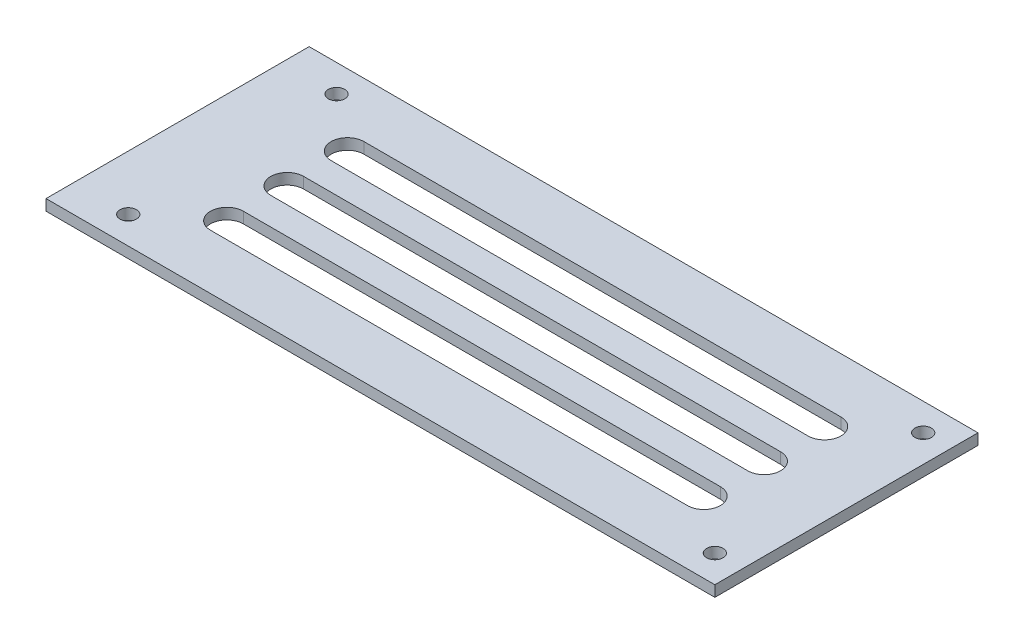
ISO-10303-21;
HEADER;
FILE_DESCRIPTION(('STEP AP214'),'2;1');
FILE_NAME('part.step','',(''),(''),'','','');
FILE_SCHEMA(('AUTOMOTIVE_DESIGN { 1 0 10303 214 1 1 1 1 }'));
ENDSEC;
DATA;
#1=APPLICATION_CONTEXT('core data for automotive mechanical design processes');
#2=APPLICATION_PROTOCOL_DEFINITION('international standard','automotive_design',2000,#1);
#3=PRODUCT_CONTEXT('',#1,'mechanical');
#4=PRODUCT('Part','Part','',(#3));
#5=PRODUCT_RELATED_PRODUCT_CATEGORY('part','',(#4));
#6=PRODUCT_DEFINITION_FORMATION('','',#4);
#7=PRODUCT_DEFINITION_CONTEXT('part definition',#1,'design');
#8=PRODUCT_DEFINITION('design','',#6,#7);
#9=PRODUCT_DEFINITION_SHAPE('','',#8);
#10=(LENGTH_UNIT() NAMED_UNIT(*) SI_UNIT(.MILLI.,.METRE.));
#11=(NAMED_UNIT(*) PLANE_ANGLE_UNIT() SI_UNIT($,.RADIAN.));
#12=(NAMED_UNIT(*) SI_UNIT($,.STERADIAN.) SOLID_ANGLE_UNIT());
#13=UNCERTAINTY_MEASURE_WITH_UNIT(LENGTH_MEASURE(1.E-05),#10,'distance_accuracy_value','');
#14=(GEOMETRIC_REPRESENTATION_CONTEXT(3) GLOBAL_UNCERTAINTY_ASSIGNED_CONTEXT((#13)) GLOBAL_UNIT_ASSIGNED_CONTEXT((#10,
#11,#12)) REPRESENTATION_CONTEXT('',''));
#15=CARTESIAN_POINT('',(0.,0.,0.));
#16=DIRECTION('',(0.,0.,1.));
#17=DIRECTION('',(1.,0.,0.));
#18=AXIS2_PLACEMENT_3D('',#15,#16,#17);
#19=CARTESIAN_POINT('',(0.,2.,0.));
#20=DIRECTION('',(0.,-1.,0.));
#21=DIRECTION('',(0.,0.,-1.));
#22=AXIS2_PLACEMENT_3D('',#19,#20,#21);
#23=PLANE('',#22);
#24=DIRECTION('',(1.,0.,0.));
#25=VECTOR('',#24,1.);
#26=CARTESIAN_POINT('',(9.99999999999969,2.,-27.));
#27=LINE('',#26,#25);
#28=CARTESIAN_POINT('',(9.99999999999969,2.,-27.));
#29=VERTEX_POINT('',#28);
#30=CARTESIAN_POINT('',(97.0000000000001,2.,-27.));
#31=VERTEX_POINT('',#30);
#32=EDGE_CURVE('E179',#29,#31,#27,.T.);
#33=ORIENTED_EDGE('',*,*,#32,.F.);
#34=CARTESIAN_POINT('',(10.0000000000001,2.,-30.));
#35=DIRECTION('',(0.,1.,0.));
#36=DIRECTION('',(0.,0.,1.));
#37=AXIS2_PLACEMENT_3D('',#34,#35,#36);
#38=CIRCLE('',#37,2.99999999999999);
#39=CARTESIAN_POINT('',(9.99999999999969,2.,-33.));
#40=VERTEX_POINT('',#39);
#41=EDGE_CURVE('E51',#40,#29,#38,.T.);
#42=ORIENTED_EDGE('',*,*,#41,.F.);
#43=DIRECTION('',(-1.,0.,0.));
#44=VECTOR('',#43,1.);
#45=CARTESIAN_POINT('',(9.99999999999969,2.,-33.));
#46=LINE('',#45,#44);
#47=CARTESIAN_POINT('',(97.0000000000001,2.,-33.));
#48=VERTEX_POINT('',#47);
#49=EDGE_CURVE('E170',#48,#40,#46,.T.);
#50=ORIENTED_EDGE('',*,*,#49,.F.);
#51=CARTESIAN_POINT('',(97.0000000000001,2.,-30.));
#52=DIRECTION('',(0.,1.,0.));
#53=DIRECTION('',(0.,0.,1.));
#54=AXIS2_PLACEMENT_3D('',#51,#52,#53);
#55=CIRCLE('',#54,3.);
#56=EDGE_CURVE('E173',#31,#48,#55,.T.);
#57=ORIENTED_EDGE('',*,*,#56,.F.);
#58=EDGE_LOOP('',(#33,#42,#50,#57));
#59=FACE_BOUND('',#58,.T.);
#60=DIRECTION('',(1.,0.,0.));
#61=VECTOR('',#60,1.);
#62=CARTESIAN_POINT('',(9.9999999999998,2.,-16.));
#63=LINE('',#62,#61);
#64=CARTESIAN_POINT('',(9.9999999999998,2.,-16.));
#65=VERTEX_POINT('',#64);
#66=CARTESIAN_POINT('',(97.0000000000002,2.,-16.));
#67=VERTEX_POINT('',#66);
#68=EDGE_CURVE('E205',#65,#67,#63,.T.);
#69=ORIENTED_EDGE('',*,*,#68,.F.);
#70=CARTESIAN_POINT('',(9.9999999999998,2.,-19.));
#71=DIRECTION('',(0.,1.,0.));
#72=DIRECTION('',(0.,0.,1.));
#73=AXIS2_PLACEMENT_3D('',#70,#71,#72);
#74=CIRCLE('',#73,2.99999999999999);
#75=CARTESIAN_POINT('',(9.9999999999998,2.,-22.));
#76=VERTEX_POINT('',#75);
#77=EDGE_CURVE('E59',#76,#65,#74,.T.);
#78=ORIENTED_EDGE('',*,*,#77,.F.);
#79=DIRECTION('',(-1.,0.,0.));
#80=VECTOR('',#79,1.);
#81=CARTESIAN_POINT('',(9.9999999999998,2.,-22.));
#82=LINE('',#81,#80);
#83=CARTESIAN_POINT('',(97.0000000000002,2.,-22.));
#84=VERTEX_POINT('',#83);
#85=EDGE_CURVE('E194',#84,#76,#82,.T.);
#86=ORIENTED_EDGE('',*,*,#85,.F.);
#87=CARTESIAN_POINT('',(97.0000000000002,2.,-19.));
#88=DIRECTION('',(0.,1.,0.));
#89=DIRECTION('',(0.,0.,1.));
#90=AXIS2_PLACEMENT_3D('',#87,#88,#89);
#91=CIRCLE('',#90,3.);
#92=EDGE_CURVE('E209',#67,#84,#91,.T.);
#93=ORIENTED_EDGE('',*,*,#92,.F.);
#94=EDGE_LOOP('',(#69,#78,#86,#93));
#95=FACE_BOUND('',#94,.T.);
#96=DIRECTION('',(1.,0.,0.));
#97=VECTOR('',#96,1.);
#98=CARTESIAN_POINT('',(9.99999999999992,2.,-5.));
#99=LINE('',#98,#97);
#100=CARTESIAN_POINT('',(9.99999999999992,2.,-5.));
#101=VERTEX_POINT('',#100);
#102=CARTESIAN_POINT('',(97.0000000000003,2.,-4.99999999999999));
#103=VERTEX_POINT('',#102);
#104=EDGE_CURVE('E236',#101,#103,#99,.T.);
#105=ORIENTED_EDGE('',*,*,#104,.F.);
#106=CARTESIAN_POINT('',(9.99999999999992,2.,-7.99999999999999));
#107=DIRECTION('',(0.,1.,0.));
#108=DIRECTION('',(0.,0.,1.));
#109=AXIS2_PLACEMENT_3D('',#106,#107,#108);
#110=CIRCLE('',#109,2.99999999999999);
#111=CARTESIAN_POINT('',(9.99999999999992,2.,-11.));
#112=VERTEX_POINT('',#111);
#113=EDGE_CURVE('E234',#112,#101,#110,.T.);
#114=ORIENTED_EDGE('',*,*,#113,.F.);
#115=DIRECTION('',(-1.,0.,0.));
#116=VECTOR('',#115,1.);
#117=CARTESIAN_POINT('',(9.99999999999992,2.,-11.));
#118=LINE('',#117,#116);
#119=CARTESIAN_POINT('',(97.0000000000003,2.,-11.));
#120=VERTEX_POINT('',#119);
#121=EDGE_CURVE('E224',#120,#112,#118,.T.);
#122=ORIENTED_EDGE('',*,*,#121,.F.);
#123=CARTESIAN_POINT('',(97.0000000000003,2.,-7.99999999999999));
#124=DIRECTION('',(0.,1.,0.));
#125=DIRECTION('',(0.,0.,1.));
#126=AXIS2_PLACEMENT_3D('',#123,#124,#125);
#127=CIRCLE('',#126,3.);
#128=EDGE_CURVE('E239',#103,#120,#127,.T.);
#129=ORIENTED_EDGE('',*,*,#128,.F.);
#130=EDGE_LOOP('',(#105,#114,#122,#129));
#131=FACE_BOUND('',#130,.T.);
#132=DIRECTION('',(0.,0.,1.));
#133=VECTOR('',#132,1.);
#134=CARTESIAN_POINT('',(-10.,2.,5.));
#135=LINE('',#134,#133);
#136=CARTESIAN_POINT('',(-10.,2.,-43.));
#137=VERTEX_POINT('',#136);
#138=CARTESIAN_POINT('',(-10.,2.,5.));
#139=VERTEX_POINT('',#138);
#140=EDGE_CURVE('E275',#137,#139,#135,.T.);
#141=ORIENTED_EDGE('',*,*,#140,.T.);
#142=DIRECTION('',(1.,0.,0.));
#143=VECTOR('',#142,1.);
#144=CARTESIAN_POINT('',(-10.,2.,5.));
#145=LINE('',#144,#143);
#146=CARTESIAN_POINT('',(112.,2.,5.));
#147=VERTEX_POINT('',#146);
#148=EDGE_CURVE('E278',#139,#147,#145,.T.);
#149=ORIENTED_EDGE('',*,*,#148,.T.);
#150=DIRECTION('',(0.,0.,-1.));
#151=VECTOR('',#150,1.);
#152=CARTESIAN_POINT('',(112.,2.,5.));
#153=LINE('',#152,#151);
#154=CARTESIAN_POINT('',(112.,2.,-43.));
#155=VERTEX_POINT('',#154);
#156=EDGE_CURVE('E281',#147,#155,#153,.T.);
#157=ORIENTED_EDGE('',*,*,#156,.T.);
#158=DIRECTION('',(-1.,0.,0.));
#159=VECTOR('',#158,1.);
#160=CARTESIAN_POINT('',(-10.,2.,-43.));
#161=LINE('',#160,#159);
#162=EDGE_CURVE('E283',#155,#137,#161,.T.);
#163=ORIENTED_EDGE('',*,*,#162,.T.);
#164=EDGE_LOOP('',(#141,#149,#157,#163));
#165=FACE_BOUND('',#164,.T.);
#166=CARTESIAN_POINT('',(0.,2.,-38.));
#167=DIRECTION('',(0.,1.,0.));
#168=DIRECTION('',(0.,0.,1.));
#169=AXIS2_PLACEMENT_3D('',#166,#167,#168);
#170=CIRCLE('',#169,1.5);
#171=CARTESIAN_POINT('',(0.,2.,-36.5));
#172=VERTEX_POINT('',#171);
#173=EDGE_CURVE('E269',#172,#172,#170,.T.);
#174=ORIENTED_EDGE('',*,*,#173,.F.);
#175=EDGE_LOOP('',(#174));
#176=FACE_BOUND('',#175,.T.);
#177=CARTESIAN_POINT('',(0.,2.,0.));
#178=DIRECTION('',(0.,1.,0.));
#179=DIRECTION('',(0.,0.,1.));
#180=AXIS2_PLACEMENT_3D('',#177,#178,#179);
#181=CIRCLE('',#180,1.5);
#182=CARTESIAN_POINT('',(0.,2.,1.5));
#183=VERTEX_POINT('',#182);
#184=EDGE_CURVE('E263',#183,#183,#181,.T.);
#185=ORIENTED_EDGE('',*,*,#184,.F.);
#186=EDGE_LOOP('',(#185));
#187=FACE_BOUND('',#186,.T.);
#188=CARTESIAN_POINT('',(107.,2.,-38.));
#189=DIRECTION('',(0.,1.,0.));
#190=DIRECTION('',(0.,0.,1.));
#191=AXIS2_PLACEMENT_3D('',#188,#189,#190);
#192=CIRCLE('',#191,1.5);
#193=CARTESIAN_POINT('',(107.,2.,-36.5));
#194=VERTEX_POINT('',#193);
#195=EDGE_CURVE('E257',#194,#194,#192,.T.);
#196=ORIENTED_EDGE('',*,*,#195,.F.);
#197=EDGE_LOOP('',(#196));
#198=FACE_BOUND('',#197,.T.);
#199=CARTESIAN_POINT('',(107.,2.,0.));
#200=DIRECTION('',(0.,1.,0.));
#201=DIRECTION('',(0.,0.,1.));
#202=AXIS2_PLACEMENT_3D('',#199,#200,#201);
#203=CIRCLE('',#202,1.5);
#204=CARTESIAN_POINT('',(107.,2.,1.5));
#205=VERTEX_POINT('',#204);
#206=EDGE_CURVE('E251',#205,#205,#203,.T.);
#207=ORIENTED_EDGE('',*,*,#206,.F.);
#208=EDGE_LOOP('',(#207));
#209=FACE_BOUND('',#208,.T.);
#210=ADVANCED_FACE('F36',(#59,#95,#131,#165,#176,#187,#198,#209),#23,.F.);
#211=CARTESIAN_POINT('',(0.,0.,0.));
#212=DIRECTION('',(0.,-1.,0.));
#213=DIRECTION('',(0.,0.,-1.));
#214=AXIS2_PLACEMENT_3D('',#211,#212,#213);
#215=PLANE('',#214);
#216=CARTESIAN_POINT('',(10.0000000000001,0.,-30.));
#217=DIRECTION('',(0.,1.,0.));
#218=DIRECTION('',(0.,0.,1.));
#219=AXIS2_PLACEMENT_3D('',#216,#217,#218);
#220=CIRCLE('',#219,2.99999999999999);
#221=CARTESIAN_POINT('',(9.99999999999969,0.,-33.));
#222=VERTEX_POINT('',#221);
#223=CARTESIAN_POINT('',(9.99999999999969,0.,-27.));
#224=VERTEX_POINT('',#223);
#225=EDGE_CURVE('E151',#222,#224,#220,.T.);
#226=ORIENTED_EDGE('',*,*,#225,.T.);
#227=DIRECTION('',(1.,0.,0.));
#228=VECTOR('',#227,1.);
#229=CARTESIAN_POINT('',(9.99999999999969,0.,-27.));
#230=LINE('',#229,#228);
#231=CARTESIAN_POINT('',(97.0000000000001,0.,-27.));
#232=VERTEX_POINT('',#231);
#233=EDGE_CURVE('E161',#224,#232,#230,.T.);
#234=ORIENTED_EDGE('',*,*,#233,.T.);
#235=CARTESIAN_POINT('',(97.0000000000001,0.,-30.));
#236=DIRECTION('',(0.,1.,0.));
#237=DIRECTION('',(0.,0.,1.));
#238=AXIS2_PLACEMENT_3D('',#235,#236,#237);
#239=CIRCLE('',#238,3.);
#240=CARTESIAN_POINT('',(97.0000000000001,0.,-33.));
#241=VERTEX_POINT('',#240);
#242=EDGE_CURVE('E165',#232,#241,#239,.T.);
#243=ORIENTED_EDGE('',*,*,#242,.T.);
#244=DIRECTION('',(-1.,0.,0.));
#245=VECTOR('',#244,1.);
#246=CARTESIAN_POINT('',(9.99999999999969,0.,-33.));
#247=LINE('',#246,#245);
#248=EDGE_CURVE('E157',#241,#222,#247,.T.);
#249=ORIENTED_EDGE('',*,*,#248,.T.);
#250=EDGE_LOOP('',(#226,#234,#243,#249));
#251=FACE_BOUND('',#250,.T.);
#252=CARTESIAN_POINT('',(9.9999999999998,0.,-19.));
#253=DIRECTION('',(0.,1.,0.));
#254=DIRECTION('',(0.,0.,1.));
#255=AXIS2_PLACEMENT_3D('',#252,#253,#254);
#256=CIRCLE('',#255,2.99999999999999);
#257=CARTESIAN_POINT('',(9.9999999999998,0.,-22.));
#258=VERTEX_POINT('',#257);
#259=CARTESIAN_POINT('',(9.9999999999998,0.,-16.));
#260=VERTEX_POINT('',#259);
#261=EDGE_CURVE('E190',#258,#260,#256,.T.);
#262=ORIENTED_EDGE('',*,*,#261,.T.);
#263=DIRECTION('',(1.,0.,0.));
#264=VECTOR('',#263,1.);
#265=CARTESIAN_POINT('',(9.9999999999998,0.,-16.));
#266=LINE('',#265,#264);
#267=CARTESIAN_POINT('',(97.0000000000002,0.,-16.));
#268=VERTEX_POINT('',#267);
#269=EDGE_CURVE('E193',#260,#268,#266,.T.);
#270=ORIENTED_EDGE('',*,*,#269,.T.);
#271=CARTESIAN_POINT('',(97.0000000000002,0.,-19.));
#272=DIRECTION('',(0.,1.,0.));
#273=DIRECTION('',(0.,0.,1.));
#274=AXIS2_PLACEMENT_3D('',#271,#272,#273);
#275=CIRCLE('',#274,3.);
#276=CARTESIAN_POINT('',(97.0000000000002,0.,-22.));
#277=VERTEX_POINT('',#276);
#278=EDGE_CURVE('E197',#268,#277,#275,.T.);
#279=ORIENTED_EDGE('',*,*,#278,.T.);
#280=DIRECTION('',(-1.,0.,0.));
#281=VECTOR('',#280,1.);
#282=CARTESIAN_POINT('',(9.9999999999998,0.,-22.));
#283=LINE('',#282,#281);
#284=EDGE_CURVE('E200',#277,#258,#283,.T.);
#285=ORIENTED_EDGE('',*,*,#284,.T.);
#286=EDGE_LOOP('',(#262,#270,#279,#285));
#287=FACE_BOUND('',#286,.T.);
#288=CARTESIAN_POINT('',(9.99999999999992,0.,-7.99999999999999));
#289=DIRECTION('',(0.,1.,0.));
#290=DIRECTION('',(0.,0.,1.));
#291=AXIS2_PLACEMENT_3D('',#288,#289,#290);
#292=CIRCLE('',#291,2.99999999999999);
#293=CARTESIAN_POINT('',(9.99999999999992,0.,-11.));
#294=VERTEX_POINT('',#293);
#295=CARTESIAN_POINT('',(9.99999999999992,0.,-5.));
#296=VERTEX_POINT('',#295);
#297=EDGE_CURVE('E220',#294,#296,#292,.T.);
#298=ORIENTED_EDGE('',*,*,#297,.T.);
#299=DIRECTION('',(1.,0.,0.));
#300=VECTOR('',#299,1.);
#301=CARTESIAN_POINT('',(9.99999999999992,0.,-5.));
#302=LINE('',#301,#300);
#303=CARTESIAN_POINT('',(97.0000000000003,0.,-4.99999999999999));
#304=VERTEX_POINT('',#303);
#305=EDGE_CURVE('E223',#296,#304,#302,.T.);
#306=ORIENTED_EDGE('',*,*,#305,.T.);
#307=CARTESIAN_POINT('',(97.0000000000003,0.,-7.99999999999999));
#308=DIRECTION('',(0.,1.,0.));
#309=DIRECTION('',(0.,0.,1.));
#310=AXIS2_PLACEMENT_3D('',#307,#308,#309);
#311=CIRCLE('',#310,3.);
#312=CARTESIAN_POINT('',(97.0000000000003,0.,-11.));
#313=VERTEX_POINT('',#312);
#314=EDGE_CURVE('E227',#304,#313,#311,.T.);
#315=ORIENTED_EDGE('',*,*,#314,.T.);
#316=DIRECTION('',(-1.,0.,0.));
#317=VECTOR('',#316,1.);
#318=CARTESIAN_POINT('',(9.99999999999992,0.,-11.));
#319=LINE('',#318,#317);
#320=EDGE_CURVE('E230',#313,#294,#319,.T.);
#321=ORIENTED_EDGE('',*,*,#320,.T.);
#322=EDGE_LOOP('',(#298,#306,#315,#321));
#323=FACE_BOUND('',#322,.T.);
#324=CARTESIAN_POINT('',(107.,0.,-38.));
#325=DIRECTION('',(0.,1.,0.));
#326=DIRECTION('',(0.,0.,1.));
#327=AXIS2_PLACEMENT_3D('',#324,#325,#326);
#328=CIRCLE('',#327,1.5);
#329=CARTESIAN_POINT('',(107.,0.,-36.5));
#330=VERTEX_POINT('',#329);
#331=EDGE_CURVE('E254',#330,#330,#328,.T.);
#332=ORIENTED_EDGE('',*,*,#331,.T.);
#333=EDGE_LOOP('',(#332));
#334=FACE_BOUND('',#333,.T.);
#335=CARTESIAN_POINT('',(0.,0.,-38.));
#336=DIRECTION('',(0.,1.,0.));
#337=DIRECTION('',(0.,0.,1.));
#338=AXIS2_PLACEMENT_3D('',#335,#336,#337);
#339=CIRCLE('',#338,1.5);
#340=CARTESIAN_POINT('',(0.,0.,-36.5));
#341=VERTEX_POINT('',#340);
#342=EDGE_CURVE('E266',#341,#341,#339,.T.);
#343=ORIENTED_EDGE('',*,*,#342,.T.);
#344=EDGE_LOOP('',(#343));
#345=FACE_BOUND('',#344,.T.);
#346=DIRECTION('',(0.,0.,1.));
#347=VECTOR('',#346,1.);
#348=CARTESIAN_POINT('',(-10.,0.,5.));
#349=LINE('',#348,#347);
#350=CARTESIAN_POINT('',(-10.,0.,-43.));
#351=VERTEX_POINT('',#350);
#352=CARTESIAN_POINT('',(-10.,0.,5.));
#353=VERTEX_POINT('',#352);
#354=EDGE_CURVE('E272',#351,#353,#349,.T.);
#355=ORIENTED_EDGE('',*,*,#354,.F.);
#356=DIRECTION('',(-1.,0.,0.));
#357=VECTOR('',#356,1.);
#358=CARTESIAN_POINT('',(-10.,0.,-43.));
#359=LINE('',#358,#357);
#360=CARTESIAN_POINT('',(112.,0.,-43.));
#361=VERTEX_POINT('',#360);
#362=EDGE_CURVE('E279',#361,#351,#359,.T.);
#363=ORIENTED_EDGE('',*,*,#362,.F.);
#364=DIRECTION('',(0.,0.,-1.));
#365=VECTOR('',#364,1.);
#366=CARTESIAN_POINT('',(112.,0.,5.));
#367=LINE('',#366,#365);
#368=CARTESIAN_POINT('',(112.,0.,5.));
#369=VERTEX_POINT('',#368);
#370=EDGE_CURVE('E290',#369,#361,#367,.T.);
#371=ORIENTED_EDGE('',*,*,#370,.F.);
#372=DIRECTION('',(1.,0.,0.));
#373=VECTOR('',#372,1.);
#374=CARTESIAN_POINT('',(-10.,0.,5.));
#375=LINE('',#374,#373);
#376=EDGE_CURVE('E288',#353,#369,#375,.T.);
#377=ORIENTED_EDGE('',*,*,#376,.F.);
#378=EDGE_LOOP('',(#355,#363,#371,#377));
#379=FACE_BOUND('',#378,.T.);
#380=CARTESIAN_POINT('',(0.,0.,0.));
#381=DIRECTION('',(0.,1.,0.));
#382=DIRECTION('',(0.,0.,1.));
#383=AXIS2_PLACEMENT_3D('',#380,#381,#382);
#384=CIRCLE('',#383,1.5);
#385=CARTESIAN_POINT('',(0.,0.,1.5));
#386=VERTEX_POINT('',#385);
#387=EDGE_CURVE('E260',#386,#386,#384,.T.);
#388=ORIENTED_EDGE('',*,*,#387,.T.);
#389=EDGE_LOOP('',(#388));
#390=FACE_BOUND('',#389,.T.);
#391=CARTESIAN_POINT('',(107.,0.,0.));
#392=DIRECTION('',(0.,1.,0.));
#393=DIRECTION('',(0.,0.,1.));
#394=AXIS2_PLACEMENT_3D('',#391,#392,#393);
#395=CIRCLE('',#394,1.5);
#396=CARTESIAN_POINT('',(107.,0.,1.5));
#397=VERTEX_POINT('',#396);
#398=EDGE_CURVE('E186',#397,#397,#395,.T.);
#399=ORIENTED_EDGE('',*,*,#398,.T.);
#400=EDGE_LOOP('',(#399));
#401=FACE_BOUND('',#400,.T.);
#402=ADVANCED_FACE('F167',(#251,#287,#323,#334,#345,#379,#390,#401),#215,.T.);
#403=CARTESIAN_POINT('',(-10.,2.,5.));
#404=DIRECTION('',(1.,0.,0.));
#405=DIRECTION('',(0.,0.,-1.));
#406=AXIS2_PLACEMENT_3D('',#403,#404,#405);
#407=PLANE('',#406);
#408=ORIENTED_EDGE('',*,*,#354,.T.);
#409=DIRECTION('',(0.,-1.,0.));
#410=VECTOR('',#409,1.);
#411=CARTESIAN_POINT('',(-10.,2.,5.));
#412=LINE('',#411,#410);
#413=EDGE_CURVE('E11',#139,#353,#412,.T.);
#414=ORIENTED_EDGE('',*,*,#413,.F.);
#415=ORIENTED_EDGE('',*,*,#140,.F.);
#416=DIRECTION('',(0.,-1.,0.));
#417=VECTOR('',#416,1.);
#418=CARTESIAN_POINT('',(-10.,2.,-43.));
#419=LINE('',#418,#417);
#420=EDGE_CURVE('E285',#137,#351,#419,.T.);
#421=ORIENTED_EDGE('',*,*,#420,.T.);
#422=EDGE_LOOP('',(#408,#414,#415,#421));
#423=FACE_BOUND('',#422,.T.);
#424=ADVANCED_FACE('F38',(#423),#407,.F.);
#425=CARTESIAN_POINT('',(-10.,2.,5.));
#426=DIRECTION('',(0.,0.,-1.));
#427=DIRECTION('',(-1.,0.,0.));
#428=AXIS2_PLACEMENT_3D('',#425,#426,#427);
#429=PLANE('',#428);
#430=ORIENTED_EDGE('',*,*,#376,.T.);
#431=DIRECTION('',(0.,-1.,0.));
#432=VECTOR('',#431,1.);
#433=CARTESIAN_POINT('',(112.,2.,5.));
#434=LINE('',#433,#432);
#435=EDGE_CURVE('E44',#147,#369,#434,.T.);
#436=ORIENTED_EDGE('',*,*,#435,.F.);
#437=ORIENTED_EDGE('',*,*,#148,.F.);
#438=ORIENTED_EDGE('',*,*,#413,.T.);
#439=EDGE_LOOP('',(#430,#436,#437,#438));
#440=FACE_BOUND('',#439,.T.);
#441=ADVANCED_FACE('F318',(#440),#429,.F.);
#442=CARTESIAN_POINT('',(112.,2.,5.));
#443=DIRECTION('',(-1.,0.,0.));
#444=DIRECTION('',(0.,0.,1.));
#445=AXIS2_PLACEMENT_3D('',#442,#443,#444);
#446=PLANE('',#445);
#447=ORIENTED_EDGE('',*,*,#370,.T.);
#448=DIRECTION('',(0.,-1.,0.));
#449=VECTOR('',#448,1.);
#450=CARTESIAN_POINT('',(112.,2.,-43.));
#451=LINE('',#450,#449);
#452=EDGE_CURVE('E295',#155,#361,#451,.T.);
#453=ORIENTED_EDGE('',*,*,#452,.F.);
#454=ORIENTED_EDGE('',*,*,#156,.F.);
#455=ORIENTED_EDGE('',*,*,#435,.T.);
#456=EDGE_LOOP('',(#447,#453,#454,#455));
#457=FACE_BOUND('',#456,.T.);
#458=ADVANCED_FACE('F302',(#457),#446,.F.);
#459=CARTESIAN_POINT('',(-10.,2.,-43.));
#460=DIRECTION('',(0.,0.,1.));
#461=DIRECTION('',(1.,0.,0.));
#462=AXIS2_PLACEMENT_3D('',#459,#460,#461);
#463=PLANE('',#462);
#464=ORIENTED_EDGE('',*,*,#362,.T.);
#465=ORIENTED_EDGE('',*,*,#420,.F.);
#466=ORIENTED_EDGE('',*,*,#162,.F.);
#467=ORIENTED_EDGE('',*,*,#452,.T.);
#468=EDGE_LOOP('',(#464,#465,#466,#467));
#469=FACE_BOUND('',#468,.T.);
#470=ADVANCED_FACE('F311',(#469),#463,.F.);
#471=CARTESIAN_POINT('',(0.,2.,-38.));
#472=DIRECTION('',(0.,-1.,0.));
#473=DIRECTION('',(0.,0.,-1.));
#474=AXIS2_PLACEMENT_3D('',#471,#472,#473);
#475=CYLINDRICAL_SURFACE('',#474,1.5);
#476=ORIENTED_EDGE('',*,*,#173,.T.);
#477=EDGE_LOOP('',(#476));
#478=FACE_BOUND('',#477,.T.);
#479=ORIENTED_EDGE('',*,*,#342,.F.);
#480=EDGE_LOOP('',(#479));
#481=FACE_BOUND('',#480,.T.);
#482=ADVANCED_FACE('F334',(#478,#481),#475,.F.);
#483=CARTESIAN_POINT('',(0.,2.,0.));
#484=DIRECTION('',(0.,-1.,0.));
#485=DIRECTION('',(0.,0.,-1.));
#486=AXIS2_PLACEMENT_3D('',#483,#484,#485);
#487=CYLINDRICAL_SURFACE('',#486,1.5);
#488=ORIENTED_EDGE('',*,*,#184,.T.);
#489=EDGE_LOOP('',(#488));
#490=FACE_BOUND('',#489,.T.);
#491=ORIENTED_EDGE('',*,*,#387,.F.);
#492=EDGE_LOOP('',(#491));
#493=FACE_BOUND('',#492,.T.);
#494=ADVANCED_FACE('F341',(#490,#493),#487,.F.);
#495=CARTESIAN_POINT('',(107.,2.,-38.));
#496=DIRECTION('',(0.,-1.,0.));
#497=DIRECTION('',(0.,0.,-1.));
#498=AXIS2_PLACEMENT_3D('',#495,#496,#497);
#499=CYLINDRICAL_SURFACE('',#498,1.5);
#500=ORIENTED_EDGE('',*,*,#195,.T.);
#501=EDGE_LOOP('',(#500));
#502=FACE_BOUND('',#501,.T.);
#503=ORIENTED_EDGE('',*,*,#331,.F.);
#504=EDGE_LOOP('',(#503));
#505=FACE_BOUND('',#504,.T.);
#506=ADVANCED_FACE('F346',(#502,#505),#499,.F.);
#507=CARTESIAN_POINT('',(107.,2.,0.));
#508=DIRECTION('',(0.,-1.,0.));
#509=DIRECTION('',(0.,0.,-1.));
#510=AXIS2_PLACEMENT_3D('',#507,#508,#509);
#511=CYLINDRICAL_SURFACE('',#510,1.5);
#512=ORIENTED_EDGE('',*,*,#206,.T.);
#513=EDGE_LOOP('',(#512));
#514=FACE_BOUND('',#513,.T.);
#515=ORIENTED_EDGE('',*,*,#398,.F.);
#516=EDGE_LOOP('',(#515));
#517=FACE_BOUND('',#516,.T.);
#518=ADVANCED_FACE('F359',(#514,#517),#511,.F.);
#519=CARTESIAN_POINT('',(9.99999999999992,0.,-7.99999999999999));
#520=DIRECTION('',(0.,1.,0.));
#521=DIRECTION('',(0.,0.,1.));
#522=AXIS2_PLACEMENT_3D('',#519,#520,#521);
#523=CYLINDRICAL_SURFACE('',#522,2.99999999999999);
#524=ORIENTED_EDGE('',*,*,#113,.T.);
#525=DIRECTION('',(0.,1.,0.));
#526=VECTOR('',#525,1.);
#527=CARTESIAN_POINT('',(9.99999999999992,0.,-5.));
#528=LINE('',#527,#526);
#529=EDGE_CURVE('E233',#296,#101,#528,.T.);
#530=ORIENTED_EDGE('',*,*,#529,.F.);
#531=ORIENTED_EDGE('',*,*,#297,.F.);
#532=DIRECTION('',(0.,1.,0.));
#533=VECTOR('',#532,1.);
#534=CARTESIAN_POINT('',(9.99999999999992,0.,-11.));
#535=LINE('',#534,#533);
#536=EDGE_CURVE('E206',#294,#112,#535,.T.);
#537=ORIENTED_EDGE('',*,*,#536,.T.);
#538=EDGE_LOOP('',(#524,#530,#531,#537));
#539=FACE_BOUND('',#538,.T.);
#540=ADVANCED_FACE('F362',(#539),#523,.F.);
#541=CARTESIAN_POINT('',(9.99999999999992,0.,-11.));
#542=DIRECTION('',(0.,0.,-1.));
#543=DIRECTION('',(-1.,0.,0.));
#544=AXIS2_PLACEMENT_3D('',#541,#542,#543);
#545=PLANE('',#544);
#546=ORIENTED_EDGE('',*,*,#121,.T.);
#547=ORIENTED_EDGE('',*,*,#536,.F.);
#548=ORIENTED_EDGE('',*,*,#320,.F.);
#549=DIRECTION('',(0.,1.,0.));
#550=VECTOR('',#549,1.);
#551=CARTESIAN_POINT('',(97.0000000000003,0.,-11.));
#552=LINE('',#551,#550);
#553=EDGE_CURVE('E245',#313,#120,#552,.T.);
#554=ORIENTED_EDGE('',*,*,#553,.T.);
#555=EDGE_LOOP('',(#546,#547,#548,#554));
#556=FACE_BOUND('',#555,.T.);
#557=ADVANCED_FACE('F370',(#556),#545,.F.);
#558=CARTESIAN_POINT('',(97.0000000000003,0.,-7.99999999999999));
#559=DIRECTION('',(0.,1.,0.));
#560=DIRECTION('',(0.,0.,1.));
#561=AXIS2_PLACEMENT_3D('',#558,#559,#560);
#562=CYLINDRICAL_SURFACE('',#561,3.);
#563=ORIENTED_EDGE('',*,*,#128,.T.);
#564=ORIENTED_EDGE('',*,*,#553,.F.);
#565=ORIENTED_EDGE('',*,*,#314,.F.);
#566=DIRECTION('',(0.,1.,0.));
#567=VECTOR('',#566,1.);
#568=CARTESIAN_POINT('',(97.0000000000003,0.,-4.99999999999999));
#569=LINE('',#568,#567);
#570=EDGE_CURVE('E247',#304,#103,#569,.T.);
#571=ORIENTED_EDGE('',*,*,#570,.T.);
#572=EDGE_LOOP('',(#563,#564,#565,#571));
#573=FACE_BOUND('',#572,.T.);
#574=ADVANCED_FACE('F380',(#573),#562,.F.);
#575=CARTESIAN_POINT('',(9.99999999999992,0.,-5.));
#576=DIRECTION('',(0.,0.,1.));
#577=DIRECTION('',(1.,0.,0.));
#578=AXIS2_PLACEMENT_3D('',#575,#576,#577);
#579=PLANE('',#578);
#580=ORIENTED_EDGE('',*,*,#104,.T.);
#581=ORIENTED_EDGE('',*,*,#570,.F.);
#582=ORIENTED_EDGE('',*,*,#305,.F.);
#583=ORIENTED_EDGE('',*,*,#529,.T.);
#584=EDGE_LOOP('',(#580,#581,#582,#583));
#585=FACE_BOUND('',#584,.T.);
#586=ADVANCED_FACE('F376',(#585),#579,.F.);
#587=CARTESIAN_POINT('',(9.9999999999998,0.,-19.));
#588=DIRECTION('',(0.,1.,0.));
#589=DIRECTION('',(0.,0.,1.));
#590=AXIS2_PLACEMENT_3D('',#587,#588,#589);
#591=CYLINDRICAL_SURFACE('',#590,2.99999999999999);
#592=ORIENTED_EDGE('',*,*,#77,.T.);
#593=DIRECTION('',(0.,1.,0.));
#594=VECTOR('',#593,1.);
#595=CARTESIAN_POINT('',(9.9999999999998,0.,-16.));
#596=LINE('',#595,#594);
#597=EDGE_CURVE('E203',#260,#65,#596,.T.);
#598=ORIENTED_EDGE('',*,*,#597,.F.);
#599=ORIENTED_EDGE('',*,*,#261,.F.);
#600=DIRECTION('',(0.,1.,0.));
#601=VECTOR('',#600,1.);
#602=CARTESIAN_POINT('',(9.9999999999998,0.,-22.));
#603=LINE('',#602,#601);
#604=EDGE_CURVE('E180',#258,#76,#603,.T.);
#605=ORIENTED_EDGE('',*,*,#604,.T.);
#606=EDGE_LOOP('',(#592,#598,#599,#605));
#607=FACE_BOUND('',#606,.T.);
#608=ADVANCED_FACE('F379',(#607),#591,.F.);
#609=CARTESIAN_POINT('',(9.9999999999998,0.,-22.));
#610=DIRECTION('',(0.,0.,-1.));
#611=DIRECTION('',(-1.,0.,0.));
#612=AXIS2_PLACEMENT_3D('',#609,#610,#611);
#613=PLANE('',#612);
#614=ORIENTED_EDGE('',*,*,#85,.T.);
#615=ORIENTED_EDGE('',*,*,#604,.F.);
#616=ORIENTED_EDGE('',*,*,#284,.F.);
#617=DIRECTION('',(0.,1.,0.));
#618=VECTOR('',#617,1.);
#619=CARTESIAN_POINT('',(97.0000000000002,0.,-22.));
#620=LINE('',#619,#618);
#621=EDGE_CURVE('E215',#277,#84,#620,.T.);
#622=ORIENTED_EDGE('',*,*,#621,.T.);
#623=EDGE_LOOP('',(#614,#615,#616,#622));
#624=FACE_BOUND('',#623,.T.);
#625=ADVANCED_FACE('F390',(#624),#613,.F.);
#626=CARTESIAN_POINT('',(97.0000000000002,0.,-19.));
#627=DIRECTION('',(0.,1.,0.));
#628=DIRECTION('',(0.,0.,1.));
#629=AXIS2_PLACEMENT_3D('',#626,#627,#628);
#630=CYLINDRICAL_SURFACE('',#629,3.);
#631=ORIENTED_EDGE('',*,*,#92,.T.);
#632=ORIENTED_EDGE('',*,*,#621,.F.);
#633=ORIENTED_EDGE('',*,*,#278,.F.);
#634=DIRECTION('',(0.,1.,0.));
#635=VECTOR('',#634,1.);
#636=CARTESIAN_POINT('',(97.0000000000002,0.,-16.));
#637=LINE('',#636,#635);
#638=EDGE_CURVE('E217',#268,#67,#637,.T.);
#639=ORIENTED_EDGE('',*,*,#638,.T.);
#640=EDGE_LOOP('',(#631,#632,#633,#639));
#641=FACE_BOUND('',#640,.T.);
#642=ADVANCED_FACE('F394',(#641),#630,.F.);
#643=CARTESIAN_POINT('',(9.9999999999998,0.,-16.));
#644=DIRECTION('',(0.,0.,1.));
#645=DIRECTION('',(1.,0.,0.));
#646=AXIS2_PLACEMENT_3D('',#643,#644,#645);
#647=PLANE('',#646);
#648=ORIENTED_EDGE('',*,*,#68,.T.);
#649=ORIENTED_EDGE('',*,*,#638,.F.);
#650=ORIENTED_EDGE('',*,*,#269,.F.);
#651=ORIENTED_EDGE('',*,*,#597,.T.);
#652=EDGE_LOOP('',(#648,#649,#650,#651));
#653=FACE_BOUND('',#652,.T.);
#654=ADVANCED_FACE('F391',(#653),#647,.F.);
#655=CARTESIAN_POINT('',(10.0000000000001,0.,-30.));
#656=DIRECTION('',(0.,1.,0.));
#657=DIRECTION('',(0.,0.,1.));
#658=AXIS2_PLACEMENT_3D('',#655,#656,#657);
#659=CYLINDRICAL_SURFACE('',#658,2.99999999999999);
#660=ORIENTED_EDGE('',*,*,#41,.T.);
#661=DIRECTION('',(0.,1.,0.));
#662=VECTOR('',#661,1.);
#663=CARTESIAN_POINT('',(9.99999999999969,0.,-27.));
#664=LINE('',#663,#662);
#665=EDGE_CURVE('E147',#224,#29,#664,.T.);
#666=ORIENTED_EDGE('',*,*,#665,.F.);
#667=ORIENTED_EDGE('',*,*,#225,.F.);
#668=DIRECTION('',(0.,1.,0.));
#669=VECTOR('',#668,1.);
#670=CARTESIAN_POINT('',(9.99999999999969,0.,-33.));
#671=LINE('',#670,#669);
#672=EDGE_CURVE('E184',#222,#40,#671,.T.);
#673=ORIENTED_EDGE('',*,*,#672,.T.);
#674=EDGE_LOOP('',(#660,#666,#667,#673));
#675=FACE_BOUND('',#674,.T.);
#676=ADVANCED_FACE('F149',(#675),#659,.F.);
#677=CARTESIAN_POINT('',(9.99999999999969,0.,-33.));
#678=DIRECTION('',(0.,0.,-1.));
#679=DIRECTION('',(-1.,0.,0.));
#680=AXIS2_PLACEMENT_3D('',#677,#678,#679);
#681=PLANE('',#680);
#682=ORIENTED_EDGE('',*,*,#49,.T.);
#683=ORIENTED_EDGE('',*,*,#672,.F.);
#684=ORIENTED_EDGE('',*,*,#248,.F.);
#685=DIRECTION('',(0.,1.,0.));
#686=VECTOR('',#685,1.);
#687=CARTESIAN_POINT('',(97.0000000000001,0.,-33.));
#688=LINE('',#687,#686);
#689=EDGE_CURVE('E187',#241,#48,#688,.T.);
#690=ORIENTED_EDGE('',*,*,#689,.T.);
#691=EDGE_LOOP('',(#682,#683,#684,#690));
#692=FACE_BOUND('',#691,.T.);
#693=ADVANCED_FACE('F404',(#692),#681,.F.);
#694=CARTESIAN_POINT('',(97.0000000000001,0.,-30.));
#695=DIRECTION('',(0.,1.,0.));
#696=DIRECTION('',(0.,0.,1.));
#697=AXIS2_PLACEMENT_3D('',#694,#695,#696);
#698=CYLINDRICAL_SURFACE('',#697,3.);
#699=ORIENTED_EDGE('',*,*,#56,.T.);
#700=ORIENTED_EDGE('',*,*,#689,.F.);
#701=ORIENTED_EDGE('',*,*,#242,.F.);
#702=DIRECTION('',(0.,1.,0.));
#703=VECTOR('',#702,1.);
#704=CARTESIAN_POINT('',(97.0000000000001,0.,-27.));
#705=LINE('',#704,#703);
#706=EDGE_CURVE('E156',#232,#31,#705,.T.);
#707=ORIENTED_EDGE('',*,*,#706,.T.);
#708=EDGE_LOOP('',(#699,#700,#701,#707));
#709=FACE_BOUND('',#708,.T.);
#710=ADVANCED_FACE('F407',(#709),#698,.F.);
#711=CARTESIAN_POINT('',(9.99999999999969,0.,-27.));
#712=DIRECTION('',(0.,0.,1.));
#713=DIRECTION('',(1.,0.,0.));
#714=AXIS2_PLACEMENT_3D('',#711,#712,#713);
#715=PLANE('',#714);
#716=ORIENTED_EDGE('',*,*,#32,.T.);
#717=ORIENTED_EDGE('',*,*,#706,.F.);
#718=ORIENTED_EDGE('',*,*,#233,.F.);
#719=ORIENTED_EDGE('',*,*,#665,.T.);
#720=EDGE_LOOP('',(#716,#717,#718,#719));
#721=FACE_BOUND('',#720,.T.);
#722=ADVANCED_FACE('F162',(#721),#715,.F.);
#723=CLOSED_SHELL('',(#210,#402,#424,#441,#458,#470,#482,#494,#506,#518,#540,#557,#574,#586,
#608,#625,#642,#654,#676,#693,#710,#722));
#724=MANIFOLD_SOLID_BREP('B2',#723);
#725=ADVANCED_BREP_SHAPE_REPRESENTATION('',(#18,#724),#14);
#726=SHAPE_DEFINITION_REPRESENTATION(#9,#725);
ENDSEC;
END-ISO-10303-21;
